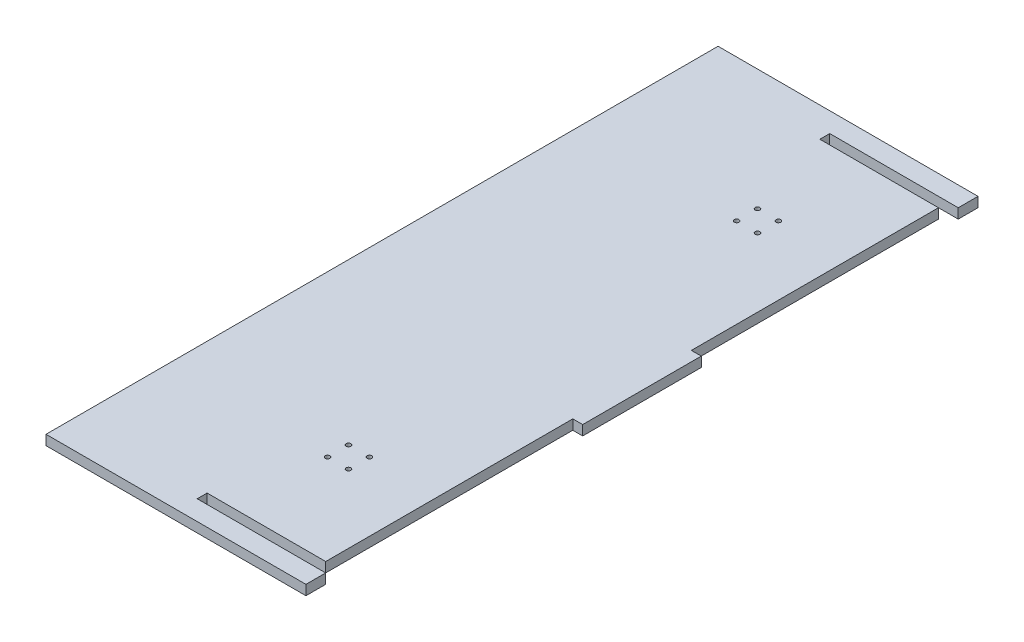
ISO-10303-21;
HEADER;
FILE_DESCRIPTION(('STEP AP214'),'2;1');
FILE_NAME('part.step','',(''),(''),'','','');
FILE_SCHEMA(('AUTOMOTIVE_DESIGN { 1 0 10303 214 1 1 1 1 }'));
ENDSEC;
DATA;
#1=APPLICATION_CONTEXT('core data for automotive mechanical design processes');
#2=APPLICATION_PROTOCOL_DEFINITION('international standard','automotive_design',2000,#1);
#3=PRODUCT_CONTEXT('',#1,'mechanical');
#4=PRODUCT('Part','Part','',(#3));
#5=PRODUCT_RELATED_PRODUCT_CATEGORY('part','',(#4));
#6=PRODUCT_DEFINITION_FORMATION('','',#4);
#7=PRODUCT_DEFINITION_CONTEXT('part definition',#1,'design');
#8=PRODUCT_DEFINITION('design','',#6,#7);
#9=PRODUCT_DEFINITION_SHAPE('','',#8);
#10=(LENGTH_UNIT() NAMED_UNIT(*) SI_UNIT(.MILLI.,.METRE.));
#11=(NAMED_UNIT(*) PLANE_ANGLE_UNIT() SI_UNIT($,.RADIAN.));
#12=(NAMED_UNIT(*) SI_UNIT($,.STERADIAN.) SOLID_ANGLE_UNIT());
#13=UNCERTAINTY_MEASURE_WITH_UNIT(LENGTH_MEASURE(1.E-05),#10,'distance_accuracy_value','');
#14=(GEOMETRIC_REPRESENTATION_CONTEXT(3) GLOBAL_UNCERTAINTY_ASSIGNED_CONTEXT((#13)) GLOBAL_UNIT_ASSIGNED_CONTEXT((#10,
#11,#12)) REPRESENTATION_CONTEXT('',''));
#15=CARTESIAN_POINT('',(0.,0.,0.));
#16=DIRECTION('',(0.,0.,1.));
#17=DIRECTION('',(1.,0.,0.));
#18=AXIS2_PLACEMENT_3D('',#15,#16,#17);
#19=CARTESIAN_POINT('',(77.1525,-3.175,-196.85));
#20=DIRECTION('',(-1.,0.,0.));
#21=DIRECTION('',(0.,0.,1.));
#22=AXIS2_PLACEMENT_3D('',#19,#20,#21);
#23=PLANE('',#22);
#24=DIRECTION('',(0.,0.,1.));
#25=VECTOR('',#24,1.);
#26=CARTESIAN_POINT('',(77.1525,3.175,-196.85));
#27=LINE('',#26,#25);
#28=CARTESIAN_POINT('',(77.1525,3.175,-196.85));
#29=VERTEX_POINT('',#28);
#30=CARTESIAN_POINT('',(77.1525,3.175,-38.1));
#31=VERTEX_POINT('',#30);
#32=EDGE_CURVE('E179',#29,#31,#27,.T.);
#33=ORIENTED_EDGE('',*,*,#32,.T.);
#34=DIRECTION('',(0.,1.,0.));
#35=VECTOR('',#34,1.);
#36=CARTESIAN_POINT('',(77.1525,-79.6391255753311,-38.1));
#37=LINE('',#36,#35);
#38=CARTESIAN_POINT('',(77.1525,-3.175,-38.1));
#39=VERTEX_POINT('',#38);
#40=EDGE_CURVE('E374',#39,#31,#37,.T.);
#41=ORIENTED_EDGE('',*,*,#40,.F.);
#42=DIRECTION('',(0.,0.,1.));
#43=VECTOR('',#42,1.);
#44=CARTESIAN_POINT('',(77.1525,-3.175,-196.85));
#45=LINE('',#44,#43);
#46=CARTESIAN_POINT('',(77.1525,-3.175,-196.85));
#47=VERTEX_POINT('',#46);
#48=EDGE_CURVE('E188',#47,#39,#45,.T.);
#49=ORIENTED_EDGE('',*,*,#48,.F.);
#50=DIRECTION('',(0.,1.,0.));
#51=VECTOR('',#50,1.);
#52=CARTESIAN_POINT('',(77.1525,-3.175,-196.85));
#53=LINE('',#52,#51);
#54=EDGE_CURVE('E193',#47,#29,#53,.T.);
#55=ORIENTED_EDGE('',*,*,#54,.T.);
#56=EDGE_LOOP('',(#33,#41,#49,#55));
#57=FACE_BOUND('',#56,.T.);
#58=ADVANCED_FACE('F33',(#57),#23,.F.);
#59=CARTESIAN_POINT('',(83.5025,3.175,-215.9));
#60=DIRECTION('',(-1.,0.,0.));
#61=DIRECTION('',(0.,0.,1.));
#62=AXIS2_PLACEMENT_3D('',#59,#60,#61);
#63=PLANE('',#62);
#64=DIRECTION('',(0.,0.,-1.));
#65=VECTOR('',#64,1.);
#66=CARTESIAN_POINT('',(83.5025,-3.175,-215.9));
#67=LINE('',#66,#65);
#68=CARTESIAN_POINT('',(83.5025,-3.175,215.9));
#69=VERTEX_POINT('',#68);
#70=CARTESIAN_POINT('',(83.5025000000001,-3.175,203.2));
#71=VERTEX_POINT('',#70);
#72=EDGE_CURVE('E204',#69,#71,#67,.T.);
#73=ORIENTED_EDGE('',*,*,#72,.T.);
#74=DIRECTION('',(0.,1.,0.));
#75=VECTOR('',#74,1.);
#76=CARTESIAN_POINT('',(83.5025000000001,-3.175,203.2));
#77=LINE('',#76,#75);
#78=CARTESIAN_POINT('',(83.5025000000001,3.175,203.2));
#79=VERTEX_POINT('',#78);
#80=EDGE_CURVE('E236',#71,#79,#77,.T.);
#81=ORIENTED_EDGE('',*,*,#80,.T.);
#82=DIRECTION('',(0.,0.,-1.));
#83=VECTOR('',#82,1.);
#84=CARTESIAN_POINT('',(83.5025,3.175,-215.9));
#85=LINE('',#84,#83);
#86=CARTESIAN_POINT('',(83.5025,3.175,215.9));
#87=VERTEX_POINT('',#86);
#88=EDGE_CURVE('E196',#87,#79,#85,.T.);
#89=ORIENTED_EDGE('',*,*,#88,.F.);
#90=DIRECTION('',(0.,-1.,0.));
#91=VECTOR('',#90,1.);
#92=CARTESIAN_POINT('',(83.5025,3.175,215.9));
#93=LINE('',#92,#91);
#94=EDGE_CURVE('E203',#87,#69,#93,.T.);
#95=ORIENTED_EDGE('',*,*,#94,.T.);
#96=EDGE_LOOP('',(#73,#81,#89,#95));
#97=FACE_BOUND('',#96,.T.);
#98=ADVANCED_FACE('F234',(#97),#63,.F.);
#99=CARTESIAN_POINT('',(83.5025,3.175,-203.2));
#100=VERTEX_POINT('',#99);
#101=CARTESIAN_POINT('',(83.5025,3.175,-215.9));
#102=VERTEX_POINT('',#101);
#103=EDGE_CURVE('E85',#100,#102,#85,.T.);
#104=ORIENTED_EDGE('',*,*,#103,.F.);
#105=DIRECTION('',(0.,1.,0.));
#106=VECTOR('',#105,1.);
#107=CARTESIAN_POINT('',(83.5025,-3.175,-203.2));
#108=LINE('',#107,#106);
#109=CARTESIAN_POINT('',(83.5025,-3.175,-203.2));
#110=VERTEX_POINT('',#109);
#111=EDGE_CURVE('E349',#110,#100,#108,.T.);
#112=ORIENTED_EDGE('',*,*,#111,.F.);
#113=CARTESIAN_POINT('',(83.5025,-3.175,-215.9));
#114=VERTEX_POINT('',#113);
#115=EDGE_CURVE('E192',#110,#114,#67,.T.);
#116=ORIENTED_EDGE('',*,*,#115,.T.);
#117=DIRECTION('',(0.,-1.,0.));
#118=VECTOR('',#117,1.);
#119=CARTESIAN_POINT('',(83.5025,3.175,-215.9));
#120=LINE('',#119,#118);
#121=EDGE_CURVE('E11',#102,#114,#120,.T.);
#122=ORIENTED_EDGE('',*,*,#121,.F.);
#123=EDGE_LOOP('',(#104,#112,#116,#122));
#124=FACE_BOUND('',#123,.T.);
#125=ADVANCED_FACE('F35',(#124),#63,.F.);
#126=CARTESIAN_POINT('',(-83.5025,3.175,-215.9));
#127=DIRECTION('',(0.,0.,1.));
#128=DIRECTION('',(1.,0.,0.));
#129=AXIS2_PLACEMENT_3D('',#126,#127,#128);
#130=PLANE('',#129);
#131=DIRECTION('',(-1.,0.,0.));
#132=VECTOR('',#131,1.);
#133=CARTESIAN_POINT('',(-83.5025,-3.175,-215.9));
#134=LINE('',#133,#132);
#135=CARTESIAN_POINT('',(-83.5025,-3.175,-215.9));
#136=VERTEX_POINT('',#135);
#137=EDGE_CURVE('E207',#114,#136,#134,.T.);
#138=ORIENTED_EDGE('',*,*,#137,.T.);
#139=DIRECTION('',(0.,-1.,0.));
#140=VECTOR('',#139,1.);
#141=CARTESIAN_POINT('',(-83.5025,3.175,-215.9));
#142=LINE('',#141,#140);
#143=CARTESIAN_POINT('',(-83.5025,3.175,-215.9));
#144=VERTEX_POINT('',#143);
#145=EDGE_CURVE('E41',#144,#136,#142,.T.);
#146=ORIENTED_EDGE('',*,*,#145,.F.);
#147=DIRECTION('',(-1.,0.,0.));
#148=VECTOR('',#147,1.);
#149=CARTESIAN_POINT('',(-83.5025,3.175,-215.9));
#150=LINE('',#149,#148);
#151=EDGE_CURVE('E198',#102,#144,#150,.T.);
#152=ORIENTED_EDGE('',*,*,#151,.F.);
#153=ORIENTED_EDGE('',*,*,#121,.T.);
#154=EDGE_LOOP('',(#138,#146,#152,#153));
#155=FACE_BOUND('',#154,.T.);
#156=ADVANCED_FACE('F245',(#155),#130,.F.);
#157=CARTESIAN_POINT('',(-83.5025,3.175,-215.9));
#158=DIRECTION('',(1.,0.,0.));
#159=DIRECTION('',(0.,0.,-1.));
#160=AXIS2_PLACEMENT_3D('',#157,#158,#159);
#161=PLANE('',#160);
#162=DIRECTION('',(0.,0.,1.));
#163=VECTOR('',#162,1.);
#164=CARTESIAN_POINT('',(-83.5025,-3.175,-215.9));
#165=LINE('',#164,#163);
#166=CARTESIAN_POINT('',(-83.5025,-3.175,215.9));
#167=VERTEX_POINT('',#166);
#168=EDGE_CURVE('E209',#136,#167,#165,.T.);
#169=ORIENTED_EDGE('',*,*,#168,.T.);
#170=DIRECTION('',(0.,-1.,0.));
#171=VECTOR('',#170,1.);
#172=CARTESIAN_POINT('',(-83.5025,3.175,215.9));
#173=LINE('',#172,#171);
#174=CARTESIAN_POINT('',(-83.5025,3.175,215.9));
#175=VERTEX_POINT('',#174);
#176=EDGE_CURVE('E213',#175,#167,#173,.T.);
#177=ORIENTED_EDGE('',*,*,#176,.F.);
#178=DIRECTION('',(0.,0.,1.));
#179=VECTOR('',#178,1.);
#180=CARTESIAN_POINT('',(-83.5025,3.175,-215.9));
#181=LINE('',#180,#179);
#182=EDGE_CURVE('E200',#144,#175,#181,.T.);
#183=ORIENTED_EDGE('',*,*,#182,.F.);
#184=ORIENTED_EDGE('',*,*,#145,.T.);
#185=EDGE_LOOP('',(#169,#177,#183,#184));
#186=FACE_BOUND('',#185,.T.);
#187=ADVANCED_FACE('F219',(#186),#161,.F.);
#188=CARTESIAN_POINT('',(-83.5025,3.175,215.9));
#189=DIRECTION('',(0.,0.,-1.));
#190=DIRECTION('',(-1.,0.,0.));
#191=AXIS2_PLACEMENT_3D('',#188,#189,#190);
#192=PLANE('',#191);
#193=DIRECTION('',(1.,0.,0.));
#194=VECTOR('',#193,1.);
#195=CARTESIAN_POINT('',(-83.5025,-3.175,215.9));
#196=LINE('',#195,#194);
#197=EDGE_CURVE('E78',#167,#69,#196,.T.);
#198=ORIENTED_EDGE('',*,*,#197,.T.);
#199=ORIENTED_EDGE('',*,*,#94,.F.);
#200=DIRECTION('',(1.,0.,0.));
#201=VECTOR('',#200,1.);
#202=CARTESIAN_POINT('',(-83.5025,3.175,215.9));
#203=LINE('',#202,#201);
#204=EDGE_CURVE('E57',#175,#87,#203,.T.);
#205=ORIENTED_EDGE('',*,*,#204,.F.);
#206=ORIENTED_EDGE('',*,*,#176,.T.);
#207=EDGE_LOOP('',(#198,#199,#205,#206));
#208=FACE_BOUND('',#207,.T.);
#209=ADVANCED_FACE('F237',(#208),#192,.F.);
#210=CARTESIAN_POINT('',(0.,3.175,0.));
#211=DIRECTION('',(0.,1.,0.));
#212=DIRECTION('',(0.,0.,1.));
#213=AXIS2_PLACEMENT_3D('',#210,#211,#212);
#214=PLANE('',#213);
#215=DIRECTION('',(1.,0.,0.));
#216=VECTOR('',#215,1.);
#217=CARTESIAN_POINT('',(83.5025,3.175,-196.85));
#218=LINE('',#217,#216);
#219=CARTESIAN_POINT('',(0.952500000000031,3.175,-196.85));
#220=VERTEX_POINT('',#219);
#221=EDGE_CURVE('E355',#220,#29,#218,.T.);
#222=ORIENTED_EDGE('',*,*,#221,.F.);
#223=DIRECTION('',(0.,0.,1.));
#224=VECTOR('',#223,1.);
#225=CARTESIAN_POINT('',(0.95250000000003,3.175,-203.2));
#226=LINE('',#225,#224);
#227=CARTESIAN_POINT('',(0.95250000000003,3.175,-203.2));
#228=VERTEX_POINT('',#227);
#229=EDGE_CURVE('E358',#228,#220,#226,.T.);
#230=ORIENTED_EDGE('',*,*,#229,.F.);
#231=DIRECTION('',(-1.,0.,0.));
#232=VECTOR('',#231,1.);
#233=CARTESIAN_POINT('',(83.5025,3.175,-203.2));
#234=LINE('',#233,#232);
#235=EDGE_CURVE('E335',#100,#228,#234,.T.);
#236=ORIENTED_EDGE('',*,*,#235,.F.);
#237=ORIENTED_EDGE('',*,*,#103,.T.);
#238=ORIENTED_EDGE('',*,*,#151,.T.);
#239=ORIENTED_EDGE('',*,*,#182,.T.);
#240=ORIENTED_EDGE('',*,*,#204,.T.);
#241=ORIENTED_EDGE('',*,*,#88,.T.);
#242=DIRECTION('',(1.,0.,0.));
#243=VECTOR('',#242,1.);
#244=CARTESIAN_POINT('',(83.5025000000001,3.175,203.2));
#245=LINE('',#244,#243);
#246=CARTESIAN_POINT('',(0.95250000000008,3.175,203.2));
#247=VERTEX_POINT('',#246);
#248=EDGE_CURVE('E336',#247,#79,#245,.T.);
#249=ORIENTED_EDGE('',*,*,#248,.F.);
#250=DIRECTION('',(0.,0.,1.));
#251=VECTOR('',#250,1.);
#252=CARTESIAN_POINT('',(0.95250000000008,3.175,203.2));
#253=LINE('',#252,#251);
#254=CARTESIAN_POINT('',(0.952500000000078,3.175,196.85));
#255=VERTEX_POINT('',#254);
#256=EDGE_CURVE('E339',#255,#247,#253,.T.);
#257=ORIENTED_EDGE('',*,*,#256,.F.);
#258=DIRECTION('',(-1.,0.,0.));
#259=VECTOR('',#258,1.);
#260=CARTESIAN_POINT('',(83.5025,3.175,196.85));
#261=LINE('',#260,#259);
#262=CARTESIAN_POINT('',(77.1525,3.175,196.85));
#263=VERTEX_POINT('',#262);
#264=EDGE_CURVE('E178',#263,#255,#261,.T.);
#265=ORIENTED_EDGE('',*,*,#264,.F.);
#266=CARTESIAN_POINT('',(77.1525,3.175,38.1));
#267=VERTEX_POINT('',#266);
#268=EDGE_CURVE('E168',#267,#263,#27,.T.);
#269=ORIENTED_EDGE('',*,*,#268,.F.);
#270=DIRECTION('',(1.,0.,0.));
#271=VECTOR('',#270,1.);
#272=CARTESIAN_POINT('',(77.1525,3.175,38.1));
#273=LINE('',#272,#271);
#274=CARTESIAN_POINT('',(83.5025,3.175,38.1));
#275=VERTEX_POINT('',#274);
#276=EDGE_CURVE('E155',#267,#275,#273,.T.);
#277=ORIENTED_EDGE('',*,*,#276,.T.);
#278=DIRECTION('',(0.,0.,-1.));
#279=VECTOR('',#278,1.);
#280=CARTESIAN_POINT('',(83.5025,3.175,-38.1));
#281=LINE('',#280,#279);
#282=CARTESIAN_POINT('',(83.5025,3.175,-38.1));
#283=VERTEX_POINT('',#282);
#284=EDGE_CURVE('E162',#275,#283,#281,.T.);
#285=ORIENTED_EDGE('',*,*,#284,.T.);
#286=DIRECTION('',(-1.,0.,0.));
#287=VECTOR('',#286,1.);
#288=CARTESIAN_POINT('',(77.1525,3.175,-38.1));
#289=LINE('',#288,#287);
#290=EDGE_CURVE('E171',#283,#31,#289,.T.);
#291=ORIENTED_EDGE('',*,*,#290,.T.);
#292=ORIENTED_EDGE('',*,*,#32,.F.);
#293=EDGE_LOOP('',(#222,#230,#236,#237,#238,#239,#240,#241,#249,#257,#265,#269,#277,#285,#291,#292));
#294=FACE_BOUND('',#293,.T.);
#295=CARTESIAN_POINT('',(19.6349855787278,3.175,-138.1125));
#296=DIRECTION('',(0.,-1.,0.));
#297=DIRECTION('',(0.,0.,-1.));
#298=AXIS2_PLACEMENT_3D('',#295,#296,#297);
#299=CIRCLE('',#298,1.49999999999999);
#300=CARTESIAN_POINT('',(19.6349855787278,3.175,-139.6125));
#301=VERTEX_POINT('',#300);
#302=EDGE_CURVE('E320',#301,#301,#299,.T.);
#303=ORIENTED_EDGE('',*,*,#302,.T.);
#304=EDGE_LOOP('',(#303));
#305=FACE_BOUND('',#304,.T.);
#306=CARTESIAN_POINT('',(33.0700144212722,3.175,-124.677471157456));
#307=DIRECTION('',(0.,-1.,0.));
#308=DIRECTION('',(0.,0.,-1.));
#309=AXIS2_PLACEMENT_3D('',#306,#307,#308);
#310=CIRCLE('',#309,1.5);
#311=CARTESIAN_POINT('',(33.0700144212722,3.175,-126.177471157456));
#312=VERTEX_POINT('',#311);
#313=EDGE_CURVE('E316',#312,#312,#310,.T.);
#314=ORIENTED_EDGE('',*,*,#313,.T.);
#315=EDGE_LOOP('',(#314));
#316=FACE_BOUND('',#315,.T.);
#317=CARTESIAN_POINT('',(33.0700144212722,3.175,-138.1125));
#318=DIRECTION('',(0.,-1.,0.));
#319=DIRECTION('',(0.,0.,-1.));
#320=AXIS2_PLACEMENT_3D('',#317,#318,#319);
#321=CIRCLE('',#320,1.5);
#322=CARTESIAN_POINT('',(33.0700144212722,3.175,-139.6125));
#323=VERTEX_POINT('',#322);
#324=EDGE_CURVE('E324',#323,#323,#321,.T.);
#325=ORIENTED_EDGE('',*,*,#324,.T.);
#326=EDGE_LOOP('',(#325));
#327=FACE_BOUND('',#326,.T.);
#328=CARTESIAN_POINT('',(19.6349855787278,3.175,-124.677471157456));
#329=DIRECTION('',(0.,-1.,0.));
#330=DIRECTION('',(0.,0.,-1.));
#331=AXIS2_PLACEMENT_3D('',#328,#329,#330);
#332=CIRCLE('',#331,1.5);
#333=CARTESIAN_POINT('',(19.6349855787278,3.175,-126.177471157456));
#334=VERTEX_POINT('',#333);
#335=EDGE_CURVE('E312',#334,#334,#332,.T.);
#336=ORIENTED_EDGE('',*,*,#335,.T.);
#337=EDGE_LOOP('',(#336));
#338=FACE_BOUND('',#337,.T.);
#339=CARTESIAN_POINT('',(19.6349855787278,3.175,138.1125));
#340=DIRECTION('',(0.,1.,0.));
#341=DIRECTION('',(0.,0.,1.));
#342=AXIS2_PLACEMENT_3D('',#339,#340,#341);
#343=CIRCLE('',#342,1.49999999999999);
#344=CARTESIAN_POINT('',(19.6349855787278,3.175,139.6125));
#345=VERTEX_POINT('',#344);
#346=EDGE_CURVE('E299',#345,#345,#343,.T.);
#347=ORIENTED_EDGE('',*,*,#346,.F.);
#348=EDGE_LOOP('',(#347));
#349=FACE_BOUND('',#348,.T.);
#350=CARTESIAN_POINT('',(33.0700144212722,3.175,124.677471157456));
#351=DIRECTION('',(0.,1.,0.));
#352=DIRECTION('',(0.,0.,1.));
#353=AXIS2_PLACEMENT_3D('',#350,#351,#352);
#354=CIRCLE('',#353,1.5);
#355=CARTESIAN_POINT('',(33.0700144212722,3.175,126.177471157456));
#356=VERTEX_POINT('',#355);
#357=EDGE_CURVE('E302',#356,#356,#354,.T.);
#358=ORIENTED_EDGE('',*,*,#357,.F.);
#359=EDGE_LOOP('',(#358));
#360=FACE_BOUND('',#359,.T.);
#361=CARTESIAN_POINT('',(33.0700144212722,3.175,138.1125));
#362=DIRECTION('',(0.,1.,0.));
#363=DIRECTION('',(0.,0.,1.));
#364=AXIS2_PLACEMENT_3D('',#361,#362,#363);
#365=CIRCLE('',#364,1.5);
#366=CARTESIAN_POINT('',(33.0700144212722,3.175,139.6125));
#367=VERTEX_POINT('',#366);
#368=EDGE_CURVE('E308',#367,#367,#365,.T.);
#369=ORIENTED_EDGE('',*,*,#368,.F.);
#370=EDGE_LOOP('',(#369));
#371=FACE_BOUND('',#370,.T.);
#372=CARTESIAN_POINT('',(19.6349855787278,3.175,124.677471157456));
#373=DIRECTION('',(0.,1.,0.));
#374=DIRECTION('',(0.,0.,1.));
#375=AXIS2_PLACEMENT_3D('',#372,#373,#374);
#376=CIRCLE('',#375,1.5);
#377=CARTESIAN_POINT('',(19.6349855787278,3.175,126.177471157456));
#378=VERTEX_POINT('',#377);
#379=EDGE_CURVE('E184',#378,#378,#376,.T.);
#380=ORIENTED_EDGE('',*,*,#379,.F.);
#381=EDGE_LOOP('',(#380));
#382=FACE_BOUND('',#381,.T.);
#383=ADVANCED_FACE('F175',(#294,#305,#316,#327,#338,#349,#360,#371,#382),#214,.T.);
#384=CARTESIAN_POINT('',(0.,-3.175,0.));
#385=DIRECTION('',(0.,1.,0.));
#386=DIRECTION('',(0.,0.,1.));
#387=AXIS2_PLACEMENT_3D('',#384,#385,#386);
#388=PLANE('',#387);
#389=CARTESIAN_POINT('',(19.6349855787278,-3.175,-138.1125));
#390=DIRECTION('',(0.,-1.,0.));
#391=DIRECTION('',(0.,0.,-1.));
#392=AXIS2_PLACEMENT_3D('',#389,#390,#391);
#393=CIRCLE('',#392,1.49999999999999);
#394=CARTESIAN_POINT('',(19.6349855787278,-3.175,-139.6125));
#395=VERTEX_POINT('',#394);
#396=EDGE_CURVE('E269',#395,#395,#393,.T.);
#397=ORIENTED_EDGE('',*,*,#396,.F.);
#398=EDGE_LOOP('',(#397));
#399=FACE_BOUND('',#398,.T.);
#400=CARTESIAN_POINT('',(33.0700144212722,-3.175,-124.677471157456));
#401=DIRECTION('',(0.,-1.,0.));
#402=DIRECTION('',(0.,0.,-1.));
#403=AXIS2_PLACEMENT_3D('',#400,#401,#402);
#404=CIRCLE('',#403,1.5);
#405=CARTESIAN_POINT('',(33.0700144212722,-3.175,-126.177471157456));
#406=VERTEX_POINT('',#405);
#407=EDGE_CURVE('E273',#406,#406,#404,.T.);
#408=ORIENTED_EDGE('',*,*,#407,.F.);
#409=EDGE_LOOP('',(#408));
#410=FACE_BOUND('',#409,.T.);
#411=CARTESIAN_POINT('',(33.0700144212722,-3.175,-138.1125));
#412=DIRECTION('',(0.,-1.,0.));
#413=DIRECTION('',(0.,0.,-1.));
#414=AXIS2_PLACEMENT_3D('',#411,#412,#413);
#415=CIRCLE('',#414,1.5);
#416=CARTESIAN_POINT('',(33.0700144212722,-3.175,-139.6125));
#417=VERTEX_POINT('',#416);
#418=EDGE_CURVE('E277',#417,#417,#415,.T.);
#419=ORIENTED_EDGE('',*,*,#418,.F.);
#420=EDGE_LOOP('',(#419));
#421=FACE_BOUND('',#420,.T.);
#422=CARTESIAN_POINT('',(19.6349855787278,-3.175,-124.677471157456));
#423=DIRECTION('',(0.,-1.,0.));
#424=DIRECTION('',(0.,0.,-1.));
#425=AXIS2_PLACEMENT_3D('',#422,#423,#424);
#426=CIRCLE('',#425,1.5);
#427=CARTESIAN_POINT('',(19.6349855787278,-3.175,-126.177471157456));
#428=VERTEX_POINT('',#427);
#429=EDGE_CURVE('E281',#428,#428,#426,.T.);
#430=ORIENTED_EDGE('',*,*,#429,.F.);
#431=EDGE_LOOP('',(#430));
#432=FACE_BOUND('',#431,.T.);
#433=CARTESIAN_POINT('',(19.6349855787278,-3.175,138.1125));
#434=DIRECTION('',(0.,1.,0.));
#435=DIRECTION('',(0.,0.,1.));
#436=AXIS2_PLACEMENT_3D('',#433,#434,#435);
#437=CIRCLE('',#436,1.49999999999999);
#438=CARTESIAN_POINT('',(19.6349855787278,-3.175,139.6125));
#439=VERTEX_POINT('',#438);
#440=EDGE_CURVE('E285',#439,#439,#437,.T.);
#441=ORIENTED_EDGE('',*,*,#440,.T.);
#442=EDGE_LOOP('',(#441));
#443=FACE_BOUND('',#442,.T.);
#444=CARTESIAN_POINT('',(33.0700144212722,-3.175,124.677471157456));
#445=DIRECTION('',(0.,1.,0.));
#446=DIRECTION('',(0.,0.,1.));
#447=AXIS2_PLACEMENT_3D('',#444,#445,#446);
#448=CIRCLE('',#447,1.5);
#449=CARTESIAN_POINT('',(33.0700144212722,-3.175,126.177471157456));
#450=VERTEX_POINT('',#449);
#451=EDGE_CURVE('E289',#450,#450,#448,.T.);
#452=ORIENTED_EDGE('',*,*,#451,.T.);
#453=EDGE_LOOP('',(#452));
#454=FACE_BOUND('',#453,.T.);
#455=CARTESIAN_POINT('',(33.0700144212722,-3.175,138.1125));
#456=DIRECTION('',(0.,1.,0.));
#457=DIRECTION('',(0.,0.,1.));
#458=AXIS2_PLACEMENT_3D('',#455,#456,#457);
#459=CIRCLE('',#458,1.5);
#460=CARTESIAN_POINT('',(33.0700144212722,-3.175,139.6125));
#461=VERTEX_POINT('',#460);
#462=EDGE_CURVE('E293',#461,#461,#459,.T.);
#463=ORIENTED_EDGE('',*,*,#462,.T.);
#464=EDGE_LOOP('',(#463));
#465=FACE_BOUND('',#464,.T.);
#466=CARTESIAN_POINT('',(19.6349855787278,-3.175,124.677471157456));
#467=DIRECTION('',(0.,1.,0.));
#468=DIRECTION('',(0.,0.,1.));
#469=AXIS2_PLACEMENT_3D('',#466,#467,#468);
#470=CIRCLE('',#469,1.5);
#471=CARTESIAN_POINT('',(19.6349855787278,-3.175,126.177471157456));
#472=VERTEX_POINT('',#471);
#473=EDGE_CURVE('E180',#472,#472,#470,.T.);
#474=ORIENTED_EDGE('',*,*,#473,.T.);
#475=EDGE_LOOP('',(#474));
#476=FACE_BOUND('',#475,.T.);
#477=DIRECTION('',(0.,0.,1.));
#478=VECTOR('',#477,1.);
#479=CARTESIAN_POINT('',(0.95250000000003,-3.175,-203.2));
#480=LINE('',#479,#478);
#481=CARTESIAN_POINT('',(0.95250000000003,-3.175,-203.2));
#482=VERTEX_POINT('',#481);
#483=CARTESIAN_POINT('',(0.952500000000031,-3.175,-196.85));
#484=VERTEX_POINT('',#483);
#485=EDGE_CURVE('E365',#482,#484,#480,.T.);
#486=ORIENTED_EDGE('',*,*,#485,.T.);
#487=DIRECTION('',(1.,0.,0.));
#488=VECTOR('',#487,1.);
#489=CARTESIAN_POINT('',(83.5025,-3.175,-196.85));
#490=LINE('',#489,#488);
#491=EDGE_CURVE('E352',#484,#47,#490,.T.);
#492=ORIENTED_EDGE('',*,*,#491,.T.);
#493=ORIENTED_EDGE('',*,*,#48,.T.);
#494=DIRECTION('',(1.,0.,0.));
#495=VECTOR('',#494,1.);
#496=CARTESIAN_POINT('',(77.1525,-3.175,-38.1));
#497=LINE('',#496,#495);
#498=CARTESIAN_POINT('',(83.5025,-3.175,-38.1));
#499=VERTEX_POINT('',#498);
#500=EDGE_CURVE('E369',#39,#499,#497,.T.);
#501=ORIENTED_EDGE('',*,*,#500,.T.);
#502=DIRECTION('',(0.,0.,1.));
#503=VECTOR('',#502,1.);
#504=CARTESIAN_POINT('',(83.5025,-3.175,-38.1));
#505=LINE('',#504,#503);
#506=CARTESIAN_POINT('',(83.5025,-3.175,38.1));
#507=VERTEX_POINT('',#506);
#508=EDGE_CURVE('E376',#499,#507,#505,.T.);
#509=ORIENTED_EDGE('',*,*,#508,.T.);
#510=DIRECTION('',(-1.,0.,0.));
#511=VECTOR('',#510,1.);
#512=CARTESIAN_POINT('',(77.1525,-3.175,38.1));
#513=LINE('',#512,#511);
#514=CARTESIAN_POINT('',(77.1525,-3.175,38.1));
#515=VERTEX_POINT('',#514);
#516=EDGE_CURVE('E343',#507,#515,#513,.T.);
#517=ORIENTED_EDGE('',*,*,#516,.T.);
#518=CARTESIAN_POINT('',(77.1525,-3.175,196.85));
#519=VERTEX_POINT('',#518);
#520=EDGE_CURVE('E170',#515,#519,#45,.T.);
#521=ORIENTED_EDGE('',*,*,#520,.T.);
#522=DIRECTION('',(-1.,0.,0.));
#523=VECTOR('',#522,1.);
#524=CARTESIAN_POINT('',(83.5025,-3.175,196.85));
#525=LINE('',#524,#523);
#526=CARTESIAN_POINT('',(0.952500000000078,-3.175,196.85));
#527=VERTEX_POINT('',#526);
#528=EDGE_CURVE('E338',#519,#527,#525,.T.);
#529=ORIENTED_EDGE('',*,*,#528,.T.);
#530=DIRECTION('',(0.,0.,1.));
#531=VECTOR('',#530,1.);
#532=CARTESIAN_POINT('',(0.95250000000008,-3.175,203.2));
#533=LINE('',#532,#531);
#534=CARTESIAN_POINT('',(0.95250000000008,-3.175,203.2));
#535=VERTEX_POINT('',#534);
#536=EDGE_CURVE('E345',#527,#535,#533,.T.);
#537=ORIENTED_EDGE('',*,*,#536,.T.);
#538=DIRECTION('',(1.,0.,0.));
#539=VECTOR('',#538,1.);
#540=CARTESIAN_POINT('',(83.5025000000001,-3.175,203.2));
#541=LINE('',#540,#539);
#542=EDGE_CURVE('E231',#535,#71,#541,.T.);
#543=ORIENTED_EDGE('',*,*,#542,.T.);
#544=ORIENTED_EDGE('',*,*,#72,.F.);
#545=ORIENTED_EDGE('',*,*,#197,.F.);
#546=ORIENTED_EDGE('',*,*,#168,.F.);
#547=ORIENTED_EDGE('',*,*,#137,.F.);
#548=ORIENTED_EDGE('',*,*,#115,.F.);
#549=DIRECTION('',(-1.,0.,0.));
#550=VECTOR('',#549,1.);
#551=CARTESIAN_POINT('',(83.5025,-3.175,-203.2));
#552=LINE('',#551,#550);
#553=EDGE_CURVE('E357',#110,#482,#552,.T.);
#554=ORIENTED_EDGE('',*,*,#553,.T.);
#555=EDGE_LOOP('',(#486,#492,#493,#501,#509,#517,#521,#529,#537,#543,#544,#545,#546,#547,#548,#554));
#556=FACE_BOUND('',#555,.T.);
#557=ADVANCED_FACE('F225',(#399,#410,#421,#432,#443,#454,#465,#476,#556),#388,.F.);
#558=ORIENTED_EDGE('',*,*,#520,.F.);
#559=DIRECTION('',(0.,1.,0.));
#560=VECTOR('',#559,1.);
#561=CARTESIAN_POINT('',(77.1525,-79.6391255753311,38.1));
#562=LINE('',#561,#560);
#563=EDGE_CURVE('E48',#515,#267,#562,.T.);
#564=ORIENTED_EDGE('',*,*,#563,.T.);
#565=ORIENTED_EDGE('',*,*,#268,.T.);
#566=DIRECTION('',(0.,1.,0.));
#567=VECTOR('',#566,1.);
#568=CARTESIAN_POINT('',(77.1525,-3.175,196.85));
#569=LINE('',#568,#567);
#570=EDGE_CURVE('E190',#519,#263,#569,.T.);
#571=ORIENTED_EDGE('',*,*,#570,.F.);
#572=EDGE_LOOP('',(#558,#564,#565,#571));
#573=FACE_BOUND('',#572,.T.);
#574=ADVANCED_FACE('F166',(#573),#23,.F.);
#575=CARTESIAN_POINT('',(19.6349855787278,-3.175,124.677471157456));
#576=DIRECTION('',(0.,1.,0.));
#577=DIRECTION('',(0.,0.,1.));
#578=AXIS2_PLACEMENT_3D('',#575,#576,#577);
#579=CYLINDRICAL_SURFACE('',#578,1.5);
#580=ORIENTED_EDGE('',*,*,#473,.F.);
#581=EDGE_LOOP('',(#580));
#582=FACE_BOUND('',#581,.T.);
#583=ORIENTED_EDGE('',*,*,#379,.T.);
#584=EDGE_LOOP('',(#583));
#585=FACE_BOUND('',#584,.T.);
#586=ADVANCED_FACE('F256',(#582,#585),#579,.F.);
#587=CARTESIAN_POINT('',(33.0700144212722,-3.175,138.1125));
#588=DIRECTION('',(0.,1.,0.));
#589=DIRECTION('',(0.,0.,1.));
#590=AXIS2_PLACEMENT_3D('',#587,#588,#589);
#591=CYLINDRICAL_SURFACE('',#590,1.5);
#592=ORIENTED_EDGE('',*,*,#462,.F.);
#593=EDGE_LOOP('',(#592));
#594=FACE_BOUND('',#593,.T.);
#595=ORIENTED_EDGE('',*,*,#368,.T.);
#596=EDGE_LOOP('',(#595));
#597=FACE_BOUND('',#596,.T.);
#598=ADVANCED_FACE('F261',(#594,#597),#591,.F.);
#599=CARTESIAN_POINT('',(33.0700144212722,-3.175,124.677471157456));
#600=DIRECTION('',(0.,1.,0.));
#601=DIRECTION('',(0.,0.,1.));
#602=AXIS2_PLACEMENT_3D('',#599,#600,#601);
#603=CYLINDRICAL_SURFACE('',#602,1.5);
#604=ORIENTED_EDGE('',*,*,#451,.F.);
#605=EDGE_LOOP('',(#604));
#606=FACE_BOUND('',#605,.T.);
#607=ORIENTED_EDGE('',*,*,#357,.T.);
#608=EDGE_LOOP('',(#607));
#609=FACE_BOUND('',#608,.T.);
#610=ADVANCED_FACE('F434',(#606,#609),#603,.F.);
#611=CARTESIAN_POINT('',(19.6349855787278,-3.175,138.1125));
#612=DIRECTION('',(0.,1.,0.));
#613=DIRECTION('',(0.,0.,1.));
#614=AXIS2_PLACEMENT_3D('',#611,#612,#613);
#615=CYLINDRICAL_SURFACE('',#614,1.49999999999999);
#616=ORIENTED_EDGE('',*,*,#440,.F.);
#617=EDGE_LOOP('',(#616));
#618=FACE_BOUND('',#617,.T.);
#619=ORIENTED_EDGE('',*,*,#346,.T.);
#620=EDGE_LOOP('',(#619));
#621=FACE_BOUND('',#620,.T.);
#622=ADVANCED_FACE('F430',(#618,#621),#615,.F.);
#623=CARTESIAN_POINT('',(19.6349855787278,-3.175,-124.677471157456));
#624=DIRECTION('',(0.,1.,0.));
#625=DIRECTION('',(0.,0.,1.));
#626=AXIS2_PLACEMENT_3D('',#623,#624,#625);
#627=CYLINDRICAL_SURFACE('',#626,1.5);
#628=ORIENTED_EDGE('',*,*,#429,.T.);
#629=EDGE_LOOP('',(#628));
#630=FACE_BOUND('',#629,.T.);
#631=ORIENTED_EDGE('',*,*,#335,.F.);
#632=EDGE_LOOP('',(#631));
#633=FACE_BOUND('',#632,.T.);
#634=ADVANCED_FACE('F420',(#630,#633),#627,.F.);
#635=CARTESIAN_POINT('',(33.0700144212722,-3.175,-138.1125));
#636=DIRECTION('',(0.,1.,0.));
#637=DIRECTION('',(0.,0.,1.));
#638=AXIS2_PLACEMENT_3D('',#635,#636,#637);
#639=CYLINDRICAL_SURFACE('',#638,1.5);
#640=ORIENTED_EDGE('',*,*,#418,.T.);
#641=EDGE_LOOP('',(#640));
#642=FACE_BOUND('',#641,.T.);
#643=ORIENTED_EDGE('',*,*,#324,.F.);
#644=EDGE_LOOP('',(#643));
#645=FACE_BOUND('',#644,.T.);
#646=ADVANCED_FACE('F416',(#642,#645),#639,.F.);
#647=CARTESIAN_POINT('',(33.0700144212722,-3.175,-124.677471157456));
#648=DIRECTION('',(0.,1.,0.));
#649=DIRECTION('',(0.,0.,1.));
#650=AXIS2_PLACEMENT_3D('',#647,#648,#649);
#651=CYLINDRICAL_SURFACE('',#650,1.5);
#652=ORIENTED_EDGE('',*,*,#407,.T.);
#653=EDGE_LOOP('',(#652));
#654=FACE_BOUND('',#653,.T.);
#655=ORIENTED_EDGE('',*,*,#313,.F.);
#656=EDGE_LOOP('',(#655));
#657=FACE_BOUND('',#656,.T.);
#658=ADVANCED_FACE('F419',(#654,#657),#651,.F.);
#659=CARTESIAN_POINT('',(19.6349855787278,-3.175,-138.1125));
#660=DIRECTION('',(0.,1.,0.));
#661=DIRECTION('',(0.,0.,1.));
#662=AXIS2_PLACEMENT_3D('',#659,#660,#661);
#663=CYLINDRICAL_SURFACE('',#662,1.49999999999999);
#664=ORIENTED_EDGE('',*,*,#396,.T.);
#665=EDGE_LOOP('',(#664));
#666=FACE_BOUND('',#665,.T.);
#667=ORIENTED_EDGE('',*,*,#302,.F.);
#668=EDGE_LOOP('',(#667));
#669=FACE_BOUND('',#668,.T.);
#670=ADVANCED_FACE('F410',(#666,#669),#663,.F.);
#671=CARTESIAN_POINT('',(83.5025,-3.175,196.85));
#672=DIRECTION('',(0.,0.,-1.));
#673=DIRECTION('',(-1.,0.,0.));
#674=AXIS2_PLACEMENT_3D('',#671,#672,#673);
#675=PLANE('',#674);
#676=ORIENTED_EDGE('',*,*,#264,.T.);
#677=DIRECTION('',(0.,1.,0.));
#678=VECTOR('',#677,1.);
#679=CARTESIAN_POINT('',(0.952500000000078,-3.175,196.85));
#680=LINE('',#679,#678);
#681=EDGE_CURVE('E329',#527,#255,#680,.T.);
#682=ORIENTED_EDGE('',*,*,#681,.F.);
#683=ORIENTED_EDGE('',*,*,#528,.F.);
#684=ORIENTED_EDGE('',*,*,#570,.T.);
#685=EDGE_LOOP('',(#676,#682,#683,#684));
#686=FACE_BOUND('',#685,.T.);
#687=ADVANCED_FACE('F395',(#686),#675,.F.);
#688=CARTESIAN_POINT('',(83.5025000000001,-3.175,203.2));
#689=DIRECTION('',(0.,0.,1.));
#690=DIRECTION('',(1.,0.,0.));
#691=AXIS2_PLACEMENT_3D('',#688,#689,#690);
#692=PLANE('',#691);
#693=ORIENTED_EDGE('',*,*,#248,.T.);
#694=ORIENTED_EDGE('',*,*,#80,.F.);
#695=ORIENTED_EDGE('',*,*,#542,.F.);
#696=DIRECTION('',(0.,1.,0.));
#697=VECTOR('',#696,1.);
#698=CARTESIAN_POINT('',(0.95250000000008,-3.175,203.2));
#699=LINE('',#698,#697);
#700=EDGE_CURVE('E332',#535,#247,#699,.T.);
#701=ORIENTED_EDGE('',*,*,#700,.T.);
#702=EDGE_LOOP('',(#693,#694,#695,#701));
#703=FACE_BOUND('',#702,.T.);
#704=ADVANCED_FACE('F401',(#703),#692,.F.);
#705=CARTESIAN_POINT('',(0.95250000000008,-3.175,203.2));
#706=DIRECTION('',(-1.,0.,0.));
#707=DIRECTION('',(0.,0.,1.));
#708=AXIS2_PLACEMENT_3D('',#705,#706,#707);
#709=PLANE('',#708);
#710=ORIENTED_EDGE('',*,*,#256,.T.);
#711=ORIENTED_EDGE('',*,*,#700,.F.);
#712=ORIENTED_EDGE('',*,*,#536,.F.);
#713=ORIENTED_EDGE('',*,*,#681,.T.);
#714=EDGE_LOOP('',(#710,#711,#712,#713));
#715=FACE_BOUND('',#714,.T.);
#716=ADVANCED_FACE('F398',(#715),#709,.F.);
#717=CARTESIAN_POINT('',(83.5025,-3.175,-196.85));
#718=DIRECTION('',(0.,0.,1.));
#719=DIRECTION('',(1.,0.,0.));
#720=AXIS2_PLACEMENT_3D('',#717,#718,#719);
#721=PLANE('',#720);
#722=ORIENTED_EDGE('',*,*,#491,.F.);
#723=DIRECTION('',(0.,1.,0.));
#724=VECTOR('',#723,1.);
#725=CARTESIAN_POINT('',(0.952500000000031,-3.175,-196.85));
#726=LINE('',#725,#724);
#727=EDGE_CURVE('E327',#484,#220,#726,.T.);
#728=ORIENTED_EDGE('',*,*,#727,.T.);
#729=ORIENTED_EDGE('',*,*,#221,.T.);
#730=ORIENTED_EDGE('',*,*,#54,.F.);
#731=EDGE_LOOP('',(#722,#728,#729,#730));
#732=FACE_BOUND('',#731,.T.);
#733=ADVANCED_FACE('F408',(#732),#721,.F.);
#734=CARTESIAN_POINT('',(0.95250000000003,-3.175,-203.2));
#735=DIRECTION('',(-1.,0.,0.));
#736=DIRECTION('',(0.,0.,1.));
#737=AXIS2_PLACEMENT_3D('',#734,#735,#736);
#738=PLANE('',#737);
#739=ORIENTED_EDGE('',*,*,#229,.T.);
#740=ORIENTED_EDGE('',*,*,#727,.F.);
#741=ORIENTED_EDGE('',*,*,#485,.F.);
#742=DIRECTION('',(0.,1.,0.));
#743=VECTOR('',#742,1.);
#744=CARTESIAN_POINT('',(0.95250000000003,-3.175,-203.2));
#745=LINE('',#744,#743);
#746=EDGE_CURVE('E351',#482,#228,#745,.T.);
#747=ORIENTED_EDGE('',*,*,#746,.T.);
#748=EDGE_LOOP('',(#739,#740,#741,#747));
#749=FACE_BOUND('',#748,.T.);
#750=ADVANCED_FACE('F499',(#749),#738,.F.);
#751=CARTESIAN_POINT('',(83.5025,-3.175,-203.2));
#752=DIRECTION('',(0.,0.,-1.));
#753=DIRECTION('',(-1.,0.,0.));
#754=AXIS2_PLACEMENT_3D('',#751,#752,#753);
#755=PLANE('',#754);
#756=ORIENTED_EDGE('',*,*,#235,.T.);
#757=ORIENTED_EDGE('',*,*,#746,.F.);
#758=ORIENTED_EDGE('',*,*,#553,.F.);
#759=ORIENTED_EDGE('',*,*,#111,.T.);
#760=EDGE_LOOP('',(#756,#757,#758,#759));
#761=FACE_BOUND('',#760,.T.);
#762=ADVANCED_FACE('F413',(#761),#755,.F.);
#763=CARTESIAN_POINT('',(77.1525,-79.6391255753311,-38.1));
#764=DIRECTION('',(0.,0.,-1.));
#765=DIRECTION('',(-1.,0.,0.));
#766=AXIS2_PLACEMENT_3D('',#763,#764,#765);
#767=PLANE('',#766);
#768=ORIENTED_EDGE('',*,*,#500,.F.);
#769=ORIENTED_EDGE('',*,*,#40,.T.);
#770=ORIENTED_EDGE('',*,*,#290,.F.);
#771=DIRECTION('',(0.,1.,0.));
#772=VECTOR('',#771,1.);
#773=CARTESIAN_POINT('',(83.5025,-79.6391255753311,-38.1));
#774=LINE('',#773,#772);
#775=EDGE_CURVE('E372',#499,#283,#774,.T.);
#776=ORIENTED_EDGE('',*,*,#775,.F.);
#777=EDGE_LOOP('',(#768,#769,#770,#776));
#778=FACE_BOUND('',#777,.T.);
#779=ADVANCED_FACE('F389',(#778),#767,.T.);
#780=CARTESIAN_POINT('',(83.5025,-79.6391255753311,-38.1));
#781=DIRECTION('',(1.,0.,0.));
#782=DIRECTION('',(0.,0.,-1.));
#783=AXIS2_PLACEMENT_3D('',#780,#781,#782);
#784=PLANE('',#783);
#785=ORIENTED_EDGE('',*,*,#508,.F.);
#786=ORIENTED_EDGE('',*,*,#775,.T.);
#787=ORIENTED_EDGE('',*,*,#284,.F.);
#788=DIRECTION('',(0.,1.,0.));
#789=VECTOR('',#788,1.);
#790=CARTESIAN_POINT('',(83.5025,-79.6391255753311,38.1));
#791=LINE('',#790,#789);
#792=EDGE_CURVE('E158',#507,#275,#791,.T.);
#793=ORIENTED_EDGE('',*,*,#792,.F.);
#794=EDGE_LOOP('',(#785,#786,#787,#793));
#795=FACE_BOUND('',#794,.T.);
#796=ADVANCED_FACE('F385',(#795),#784,.T.);
#797=CARTESIAN_POINT('',(77.1525,-79.6391255753311,38.1));
#798=DIRECTION('',(0.,0.,1.));
#799=DIRECTION('',(1.,0.,0.));
#800=AXIS2_PLACEMENT_3D('',#797,#798,#799);
#801=PLANE('',#800);
#802=ORIENTED_EDGE('',*,*,#516,.F.);
#803=ORIENTED_EDGE('',*,*,#792,.T.);
#804=ORIENTED_EDGE('',*,*,#276,.F.);
#805=ORIENTED_EDGE('',*,*,#563,.F.);
#806=EDGE_LOOP('',(#802,#803,#804,#805));
#807=FACE_BOUND('',#806,.T.);
#808=ADVANCED_FACE('F156',(#807),#801,.T.);
#809=CLOSED_SHELL('',(#58,#98,#125,#156,#187,#209,#383,#557,#574,#586,#598,#610,#622,#634,#646,
#658,#670,#687,#704,#716,#733,#750,#762,#779,#796,#808));
#810=MANIFOLD_SOLID_BREP('B2',#809);
#811=ADVANCED_BREP_SHAPE_REPRESENTATION('',(#18,#810),#14);
#812=SHAPE_DEFINITION_REPRESENTATION(#9,#811);
ENDSEC;
END-ISO-10303-21;
